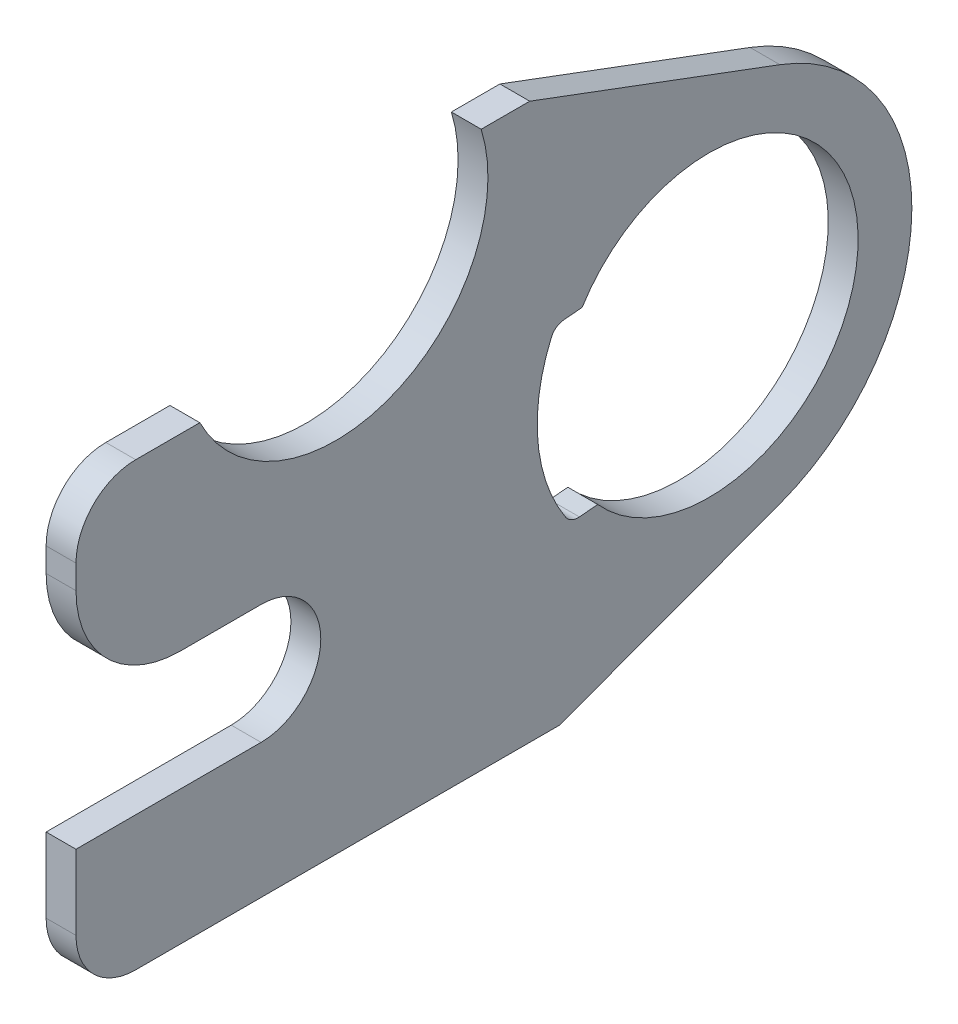
ISO-10303-21;
HEADER;
FILE_DESCRIPTION(('STEP AP214'),'2;1');
FILE_NAME('part.step','',(''),(''),'','','');
FILE_SCHEMA(('AUTOMOTIVE_DESIGN { 1 0 10303 214 1 1 1 1 }'));
ENDSEC;
DATA;
#1=APPLICATION_CONTEXT('core data for automotive mechanical design processes');
#2=APPLICATION_PROTOCOL_DEFINITION('international standard','automotive_design',2000,#1);
#3=PRODUCT_CONTEXT('',#1,'mechanical');
#4=PRODUCT('Part','Part','',(#3));
#5=PRODUCT_RELATED_PRODUCT_CATEGORY('part','',(#4));
#6=PRODUCT_DEFINITION_FORMATION('','',#4);
#7=PRODUCT_DEFINITION_CONTEXT('part definition',#1,'design');
#8=PRODUCT_DEFINITION('design','',#6,#7);
#9=PRODUCT_DEFINITION_SHAPE('','',#8);
#10=(LENGTH_UNIT() NAMED_UNIT(*) SI_UNIT(.MILLI.,.METRE.));
#11=(NAMED_UNIT(*) PLANE_ANGLE_UNIT() SI_UNIT($,.RADIAN.));
#12=(NAMED_UNIT(*) SI_UNIT($,.STERADIAN.) SOLID_ANGLE_UNIT());
#13=UNCERTAINTY_MEASURE_WITH_UNIT(LENGTH_MEASURE(1.E-05),#10,'distance_accuracy_value','');
#14=(GEOMETRIC_REPRESENTATION_CONTEXT(3) GLOBAL_UNCERTAINTY_ASSIGNED_CONTEXT((#13)) GLOBAL_UNIT_ASSIGNED_CONTEXT((#10,
#11,#12)) REPRESENTATION_CONTEXT('',''));
#15=CARTESIAN_POINT('',(0.,0.,0.));
#16=DIRECTION('',(0.,0.,1.));
#17=DIRECTION('',(1.,0.,0.));
#18=AXIS2_PLACEMENT_3D('',#15,#16,#17);
#19=CARTESIAN_POINT('',(9.9999999999969,-25.9999999999938,149.999999999999));
#20=DIRECTION('',(1.,0.,0.));
#21=DIRECTION('',(0.,0.,-1.));
#22=AXIS2_PLACEMENT_3D('',#19,#20,#21);
#23=PLANE('',#22);
#24=DIRECTION('',(0.,-0.0871557427476621,0.996194698091745));
#25=VECTOR('',#24,1.);
#26=CARTESIAN_POINT('',(10.0000000000009,26.3996112328521,42.4624602061012));
#27=LINE('',#26,#25);
#28=CARTESIAN_POINT('',(10.0000000000009,26.3996112328521,42.4624602061012));
#29=VERTEX_POINT('',#28);
#30=CARTESIAN_POINT('',(10.,25.8622557011653,48.6044620384565));
#31=VERTEX_POINT('',#30);
#32=EDGE_CURVE('E176',#29,#31,#27,.T.);
#33=ORIENTED_EDGE('',*,*,#32,.F.);
#34=CARTESIAN_POINT('',(10.,6.21724893790088E-12,8.88178419700125E-13));
#35=DIRECTION('',(1.,0.,0.));
#36=DIRECTION('',(0.,0.,-1.));
#37=AXIS2_PLACEMENT_3D('',#34,#35,#36);
#38=CIRCLE('',#37,50.);
#39=CARTESIAN_POINT('',(10.,-33.3720706526527,37.2331156412411));
#40=VERTEX_POINT('',#39);
#41=EDGE_CURVE('E188',#40,#29,#38,.T.);
#42=ORIENTED_EDGE('',*,*,#41,.F.);
#43=DIRECTION('',(0.,0.0871557427476621,-0.996194698091745));
#44=VECTOR('',#43,1.);
#45=CARTESIAN_POINT('',(10.,-33.3720706526527,37.2331156412411));
#46=LINE('',#45,#44);
#47=CARTESIAN_POINT('',(10.0000000000009,-33.9094261843395,43.3751174735981));
#48=VERTEX_POINT('',#47);
#49=EDGE_CURVE('E190',#48,#40,#46,.T.);
#50=ORIENTED_EDGE('',*,*,#49,.F.);
#51=CARTESIAN_POINT('',(9.9999999999979,-28.9284526938807,43.8108961873347));
#52=DIRECTION('',(1.,0.,0.));
#53=DIRECTION('',(0.,0.,-1.));
#54=AXIS2_PLACEMENT_3D('',#51,#52,#53);
#55=CIRCLE('',#54,5.);
#56=CARTESIAN_POINT('',(10.,-31.6835434266318,47.983362490891));
#57=VERTEX_POINT('',#56);
#58=EDGE_CURVE('E321',#48,#57,#55,.F.);
#59=ORIENTED_EDGE('',*,*,#58,.T.);
#60=CARTESIAN_POINT('',(10.,6.21724893790088E-12,8.88178419700125E-13));
#61=DIRECTION('',(1.,0.,0.));
#62=DIRECTION('',(0.,0.,-1.));
#63=AXIS2_PLACEMENT_3D('',#60,#61,#62);
#64=CIRCLE('',#63,57.5);
#65=CARTESIAN_POINT('',(10.0000000000031,22.8699757545827,52.7561769746914));
#66=VERTEX_POINT('',#65);
#67=EDGE_CURVE('E336',#66,#57,#64,.T.);
#68=ORIENTED_EDGE('',*,*,#67,.F.);
#69=CARTESIAN_POINT('',(10.0000000000031,20.8812822107065,48.1686833247181));
#70=DIRECTION('',(1.,0.,0.));
#71=DIRECTION('',(0.,0.,-1.));
#72=AXIS2_PLACEMENT_3D('',#69,#70,#71);
#73=CIRCLE('',#72,5.);
#74=EDGE_CURVE('E42',#66,#31,#73,.F.);
#75=ORIENTED_EDGE('',*,*,#74,.T.);
#76=EDGE_LOOP('',(#33,#42,#50,#59,#68,#75));
#77=FACE_BOUND('',#76,.T.);
#78=DIRECTION('',(0.,-1.,0.));
#79=VECTOR('',#78,1.);
#80=CARTESIAN_POINT('',(10.,-5.99999999999379,211.999999999999));
#81=LINE('',#80,#79);
#82=CARTESIAN_POINT('',(9.9999999999969,37.0000000000061,211.999999999999));
#83=VERTEX_POINT('',#82);
#84=CARTESIAN_POINT('',(10.,29.0000000000061,211.999999999999));
#85=VERTEX_POINT('',#84);
#86=EDGE_CURVE('E224',#83,#85,#81,.T.);
#87=ORIENTED_EDGE('',*,*,#86,.T.);
#88=CARTESIAN_POINT('',(10.,29.0000000000061,176.999999999999));
#89=DIRECTION('',(1.,0.,0.));
#90=DIRECTION('',(0.,0.,-1.));
#91=AXIS2_PLACEMENT_3D('',#88,#89,#90);
#92=CIRCLE('',#91,35.);
#93=CARTESIAN_POINT('',(10.,-5.99999999999379,176.999999999999));
#94=VERTEX_POINT('',#93);
#95=EDGE_CURVE('E307',#85,#94,#92,.T.);
#96=ORIENTED_EDGE('',*,*,#95,.T.);
#97=DIRECTION('',(0.,0.,-1.));
#98=VECTOR('',#97,1.);
#99=CARTESIAN_POINT('',(10.,-5.99999999999379,149.999999999999));
#100=LINE('',#99,#98);
#101=CARTESIAN_POINT('',(10.,-5.99999999999379,149.999999999999));
#102=VERTEX_POINT('',#101);
#103=EDGE_CURVE('E227',#94,#102,#100,.T.);
#104=ORIENTED_EDGE('',*,*,#103,.T.);
#105=CARTESIAN_POINT('',(9.9999999999969,-25.9999999999938,149.999999999999));
#106=DIRECTION('',(-1.,0.,0.));
#107=DIRECTION('',(0.,0.,-1.));
#108=AXIS2_PLACEMENT_3D('',#105,#106,#107);
#109=CIRCLE('',#108,20.);
#110=CARTESIAN_POINT('',(10.0000000000031,-45.9999999999938,149.999999999999));
#111=VERTEX_POINT('',#110);
#112=EDGE_CURVE('E229',#102,#111,#109,.T.);
#113=ORIENTED_EDGE('',*,*,#112,.T.);
#114=DIRECTION('',(0.,0.,1.));
#115=VECTOR('',#114,1.);
#116=CARTESIAN_POINT('',(10.0000000000031,-45.9999999999938,211.999999999999));
#117=LINE('',#116,#115);
#118=CARTESIAN_POINT('',(10.0000000000031,-45.9999999999938,211.999999999999));
#119=VERTEX_POINT('',#118);
#120=EDGE_CURVE('E231',#111,#119,#117,.T.);
#121=ORIENTED_EDGE('',*,*,#120,.T.);
#122=DIRECTION('',(0.,-1.,0.));
#123=VECTOR('',#122,1.);
#124=CARTESIAN_POINT('',(9.9999999999969,-90.9999999999939,211.999999999999));
#125=LINE('',#124,#123);
#126=CARTESIAN_POINT('',(10.0000000000062,-70.9999999999938,211.999999999999));
#127=VERTEX_POINT('',#126);
#128=EDGE_CURVE('E205',#119,#127,#125,.T.);
#129=ORIENTED_EDGE('',*,*,#128,.T.);
#130=CARTESIAN_POINT('',(10.0000000000062,-70.9999999999938,191.999999999999));
#131=DIRECTION('',(1.,0.,0.));
#132=DIRECTION('',(0.,0.,-1.));
#133=AXIS2_PLACEMENT_3D('',#130,#131,#132);
#134=CIRCLE('',#133,20.);
#135=CARTESIAN_POINT('',(9.9999999999969,-90.9999999999939,191.999999999998));
#136=VERTEX_POINT('',#135);
#137=EDGE_CURVE('E293',#127,#136,#134,.T.);
#138=ORIENTED_EDGE('',*,*,#137,.T.);
#139=DIRECTION('',(0.,0.,-1.));
#140=VECTOR('',#139,1.);
#141=CARTESIAN_POINT('',(9.9999999999969,-90.9999999999939,211.999999999999));
#142=LINE('',#141,#140);
#143=CARTESIAN_POINT('',(9.9999999999969,-90.9999999999939,49.9999999999989));
#144=VERTEX_POINT('',#143);
#145=EDGE_CURVE('E208',#136,#144,#142,.T.);
#146=ORIENTED_EDGE('',*,*,#145,.T.);
#147=DIRECTION('',(0.,0.346948924771803,-0.937884024599892));
#148=VECTOR('',#147,1.);
#149=CARTESIAN_POINT('',(9.9999999999969,-90.9999999999939,49.9999999999989));
#150=LINE('',#149,#148);
#151=CARTESIAN_POINT('',(10.0000000000006,-63.7761136727865,-23.5925268844817));
#152=VERTEX_POINT('',#151);
#153=EDGE_CURVE('E211',#144,#152,#150,.T.);
#154=ORIENTED_EDGE('',*,*,#153,.T.);
#155=CARTESIAN_POINT('',(10.,6.21724893790088E-12,8.88178419700125E-13));
#156=DIRECTION('',(1.,0.,0.));
#157=DIRECTION('',(0.,0.,-1.));
#158=AXIS2_PLACEMENT_3D('',#155,#156,#157);
#159=CIRCLE('',#158,68.);
#160=CARTESIAN_POINT('',(10.0000000000001,63.7013149393039,-23.7937486538868));
#161=VERTEX_POINT('',#160);
#162=EDGE_CURVE('E213',#152,#161,#159,.T.);
#163=ORIENTED_EDGE('',*,*,#162,.T.);
#164=DIRECTION('',(0.,0.349908068439531,0.936784043224967));
#165=VECTOR('',#164,1.);
#166=CARTESIAN_POINT('',(10.0000000000009,95.0000000000062,59.9999999999987));
#167=LINE('',#166,#165);
#168=CARTESIAN_POINT('',(10.0000000000009,95.0000000000062,59.9999999999987));
#169=VERTEX_POINT('',#168);
#170=EDGE_CURVE('E215',#161,#169,#167,.T.);
#171=ORIENTED_EDGE('',*,*,#170,.T.);
#172=DIRECTION('',(0.,0.,1.));
#173=VECTOR('',#172,1.);
#174=CARTESIAN_POINT('',(10.0000000000009,95.0000000000062,59.9999999999987));
#175=LINE('',#174,#173);
#176=CARTESIAN_POINT('',(10.0000000000009,95.0000000000061,76.2557695721835));
#177=VERTEX_POINT('',#176);
#178=EDGE_CURVE('E217',#169,#177,#175,.T.);
#179=ORIENTED_EDGE('',*,*,#178,.T.);
#180=CARTESIAN_POINT('',(10.0000000000071,80.0000000000062,124.999999999998));
#181=DIRECTION('',(-1.,0.,0.));
#182=DIRECTION('',(0.,0.,-1.));
#183=AXIS2_PLACEMENT_3D('',#180,#181,#182);
#184=CIRCLE('',#183,51.);
#185=CARTESIAN_POINT('',(10.0000000000009,57.0000000000062,170.519226706963));
#186=VERTEX_POINT('',#185);
#187=EDGE_CURVE('E219',#177,#186,#184,.T.);
#188=ORIENTED_EDGE('',*,*,#187,.T.);
#189=DIRECTION('',(0.,0.,1.));
#190=VECTOR('',#189,1.);
#191=CARTESIAN_POINT('',(10.,57.0000000000062,211.999999999999));
#192=LINE('',#191,#190);
#193=CARTESIAN_POINT('',(10.,57.0000000000062,191.999999999999));
#194=VERTEX_POINT('',#193);
#195=EDGE_CURVE('E221',#186,#194,#192,.T.);
#196=ORIENTED_EDGE('',*,*,#195,.T.);
#197=CARTESIAN_POINT('',(9.9999999999969,37.0000000000061,191.999999999998));
#198=DIRECTION('',(1.,0.,0.));
#199=DIRECTION('',(0.,0.,-1.));
#200=AXIS2_PLACEMENT_3D('',#197,#198,#199);
#201=CIRCLE('',#200,20.);
#202=EDGE_CURVE('E291',#194,#83,#201,.T.);
#203=ORIENTED_EDGE('',*,*,#202,.T.);
#204=EDGE_LOOP('',(#87,#96,#104,#113,#121,#129,#138,#146,#154,#163,#171,#179,#188,#196,#203));
#205=FACE_BOUND('',#204,.T.);
#206=ADVANCED_FACE('F34',(#77,#205),#23,.T.);
#207=CARTESIAN_POINT('',(-3.10862446895044E-12,-26.,150.));
#208=DIRECTION('',(1.,0.,0.));
#209=DIRECTION('',(0.,0.,-1.));
#210=AXIS2_PLACEMENT_3D('',#207,#208,#209);
#211=PLANE('',#210);
#212=DIRECTION('',(0.,0.,-1.));
#213=VECTOR('',#212,1.);
#214=CARTESIAN_POINT('',(0.,-6.00000000000001,150.));
#215=LINE('',#214,#213);
#216=CARTESIAN_POINT('',(0.,-6.00000000000001,177.));
#217=VERTEX_POINT('',#216);
#218=CARTESIAN_POINT('',(0.,-6.00000000000001,150.));
#219=VERTEX_POINT('',#218);
#220=EDGE_CURVE('E251',#217,#219,#215,.T.);
#221=ORIENTED_EDGE('',*,*,#220,.F.);
#222=CARTESIAN_POINT('',(0.,29.,177.));
#223=DIRECTION('',(1.,0.,0.));
#224=DIRECTION('',(0.,0.,-1.));
#225=AXIS2_PLACEMENT_3D('',#222,#223,#224);
#226=CIRCLE('',#225,35.);
#227=CARTESIAN_POINT('',(0.,29.,212.000000000001));
#228=VERTEX_POINT('',#227);
#229=EDGE_CURVE('E303',#217,#228,#226,.F.);
#230=ORIENTED_EDGE('',*,*,#229,.T.);
#231=DIRECTION('',(0.,-1.,0.));
#232=VECTOR('',#231,1.);
#233=CARTESIAN_POINT('',(0.,-6.00000000000001,212.000000000001));
#234=LINE('',#233,#232);
#235=CARTESIAN_POINT('',(-3.10862446895044E-12,37.,212.000000000001));
#236=VERTEX_POINT('',#235);
#237=EDGE_CURVE('E248',#236,#228,#234,.T.);
#238=ORIENTED_EDGE('',*,*,#237,.F.);
#239=CARTESIAN_POINT('',(-3.10862446895044E-12,37.,192.));
#240=DIRECTION('',(1.,0.,0.));
#241=DIRECTION('',(0.,0.,-1.));
#242=AXIS2_PLACEMENT_3D('',#239,#240,#241);
#243=CIRCLE('',#242,20.);
#244=CARTESIAN_POINT('',(0.,57.,192.));
#245=VERTEX_POINT('',#244);
#246=EDGE_CURVE('E285',#236,#245,#243,.F.);
#247=ORIENTED_EDGE('',*,*,#246,.T.);
#248=DIRECTION('',(0.,0.,1.));
#249=VECTOR('',#248,1.);
#250=CARTESIAN_POINT('',(0.,57.,212.000000000001));
#251=LINE('',#250,#249);
#252=CARTESIAN_POINT('',(8.88178419700125E-13,57.,170.519226706965));
#253=VERTEX_POINT('',#252);
#254=EDGE_CURVE('E245',#253,#245,#251,.T.);
#255=ORIENTED_EDGE('',*,*,#254,.F.);
#256=CARTESIAN_POINT('',(7.105427357601E-12,80.,125.000000000001));
#257=DIRECTION('',(-1.,0.,0.));
#258=DIRECTION('',(0.,0.,-1.));
#259=AXIS2_PLACEMENT_3D('',#256,#257,#258);
#260=CIRCLE('',#259,51.);
#261=CARTESIAN_POINT('',(8.88178419700125E-13,95.,76.2557695721844));
#262=VERTEX_POINT('',#261);
#263=EDGE_CURVE('E243',#262,#253,#260,.T.);
#264=ORIENTED_EDGE('',*,*,#263,.F.);
#265=DIRECTION('',(0.,0.,1.));
#266=VECTOR('',#265,1.);
#267=CARTESIAN_POINT('',(8.88178419700125E-13,95.,59.9999999999996));
#268=LINE('',#267,#266);
#269=CARTESIAN_POINT('',(8.88178419700125E-13,95.,59.9999999999996));
#270=VERTEX_POINT('',#269);
#271=EDGE_CURVE('E241',#270,#262,#268,.T.);
#272=ORIENTED_EDGE('',*,*,#271,.F.);
#273=DIRECTION('',(0.,0.349908068439531,0.936784043224967));
#274=VECTOR('',#273,1.);
#275=CARTESIAN_POINT('',(8.88178419700125E-13,95.,59.9999999999996));
#276=LINE('',#275,#274);
#277=CARTESIAN_POINT('',(5.55111512312578E-13,63.7013149392978,-23.7937486538886));
#278=VERTEX_POINT('',#277);
#279=EDGE_CURVE('E239',#278,#270,#276,.T.);
#280=ORIENTED_EDGE('',*,*,#279,.F.);
#281=CARTESIAN_POINT('',(0.,0.,0.));
#282=DIRECTION('',(1.,0.,0.));
#283=DIRECTION('',(0.,0.,-1.));
#284=AXIS2_PLACEMENT_3D('',#281,#282,#283);
#285=CIRCLE('',#284,68.);
#286=CARTESIAN_POINT('',(8.88178419700125E-13,-63.7761136727927,-23.5925268844825));
#287=VERTEX_POINT('',#286);
#288=EDGE_CURVE('E237',#287,#278,#285,.T.);
#289=ORIENTED_EDGE('',*,*,#288,.F.);
#290=DIRECTION('',(0.,0.346948924771803,-0.937884024599892));
#291=VECTOR('',#290,1.);
#292=CARTESIAN_POINT('',(-3.10862446895044E-12,-91.,49.9999999999998));
#293=LINE('',#292,#291);
#294=CARTESIAN_POINT('',(-3.10862446895044E-12,-91.,49.9999999999998));
#295=VERTEX_POINT('',#294);
#296=EDGE_CURVE('E235',#295,#287,#293,.T.);
#297=ORIENTED_EDGE('',*,*,#296,.F.);
#298=DIRECTION('',(0.,0.,-1.));
#299=VECTOR('',#298,1.);
#300=CARTESIAN_POINT('',(-3.10862446895044E-12,-91.,212.000000000001));
#301=LINE('',#300,#299);
#302=CARTESIAN_POINT('',(-3.10862446895044E-12,-91.,192.));
#303=VERTEX_POINT('',#302);
#304=EDGE_CURVE('E199',#303,#295,#301,.T.);
#305=ORIENTED_EDGE('',*,*,#304,.F.);
#306=CARTESIAN_POINT('',(6.21724893790088E-12,-71.0000000000001,192.));
#307=DIRECTION('',(1.,0.,0.));
#308=DIRECTION('',(0.,0.,-1.));
#309=AXIS2_PLACEMENT_3D('',#306,#307,#308);
#310=CIRCLE('',#309,20.);
#311=CARTESIAN_POINT('',(6.21724893790088E-12,-71.0000000000001,212.000000000001));
#312=VERTEX_POINT('',#311);
#313=EDGE_CURVE('E287',#303,#312,#310,.F.);
#314=ORIENTED_EDGE('',*,*,#313,.T.);
#315=DIRECTION('',(0.,-1.,0.));
#316=VECTOR('',#315,1.);
#317=CARTESIAN_POINT('',(-3.10862446895044E-12,-91.,212.000000000001));
#318=LINE('',#317,#316);
#319=CARTESIAN_POINT('',(3.10862446895044E-12,-46.,212.000000000001));
#320=VERTEX_POINT('',#319);
#321=EDGE_CURVE('E195',#320,#312,#318,.T.);
#322=ORIENTED_EDGE('',*,*,#321,.F.);
#323=DIRECTION('',(0.,0.,1.));
#324=VECTOR('',#323,1.);
#325=CARTESIAN_POINT('',(3.10862446895044E-12,-46.,212.000000000001));
#326=LINE('',#325,#324);
#327=CARTESIAN_POINT('',(3.10862446895044E-12,-46.,150.));
#328=VERTEX_POINT('',#327);
#329=EDGE_CURVE('E209',#328,#320,#326,.T.);
#330=ORIENTED_EDGE('',*,*,#329,.F.);
#331=CARTESIAN_POINT('',(-3.10862446895044E-12,-26.,150.));
#332=DIRECTION('',(-1.,0.,0.));
#333=DIRECTION('',(0.,0.,-1.));
#334=AXIS2_PLACEMENT_3D('',#331,#332,#333);
#335=CIRCLE('',#334,20.);
#336=EDGE_CURVE('E253',#219,#328,#335,.T.);
#337=ORIENTED_EDGE('',*,*,#336,.F.);
#338=EDGE_LOOP('',(#221,#230,#238,#247,#255,#264,#272,#280,#289,#297,#305,#314,#322,#330,#337));
#339=FACE_BOUND('',#338,.T.);
#340=CARTESIAN_POINT('',(0.,0.,0.));
#341=DIRECTION('',(1.,0.,0.));
#342=DIRECTION('',(0.,0.,-1.));
#343=AXIS2_PLACEMENT_3D('',#340,#341,#342);
#344=CIRCLE('',#343,50.);
#345=CARTESIAN_POINT('',(0.,-33.3720706526588,37.2331156412402));
#346=VERTEX_POINT('',#345);
#347=CARTESIAN_POINT('',(8.88178419700125E-13,26.3996112328458,42.4624602061003));
#348=VERTEX_POINT('',#347);
#349=EDGE_CURVE('E196',#346,#348,#344,.T.);
#350=ORIENTED_EDGE('',*,*,#349,.T.);
#351=DIRECTION('',(0.,-0.0871557427476622,0.996194698091745));
#352=VECTOR('',#351,1.);
#353=CARTESIAN_POINT('',(7.105427357601E-12,16.6647284068907,153.732680068016));
#354=LINE('',#353,#352);
#355=CARTESIAN_POINT('',(0.,25.8622557011591,48.6044620384574));
#356=VERTEX_POINT('',#355);
#357=EDGE_CURVE('E177',#348,#356,#354,.T.);
#358=ORIENTED_EDGE('',*,*,#357,.T.);
#359=CARTESIAN_POINT('',(3.10862446895044E-12,20.8812822107004,48.168683324719));
#360=DIRECTION('',(1.,0.,0.));
#361=DIRECTION('',(0.,0.,-1.));
#362=AXIS2_PLACEMENT_3D('',#359,#360,#361);
#363=CIRCLE('',#362,5.);
#364=CARTESIAN_POINT('',(3.10862446895044E-12,22.8699757545766,52.7561769746923));
#365=VERTEX_POINT('',#364);
#366=EDGE_CURVE('E11',#356,#365,#363,.T.);
#367=ORIENTED_EDGE('',*,*,#366,.T.);
#368=CARTESIAN_POINT('',(0.,0.,0.));
#369=DIRECTION('',(1.,0.,0.));
#370=DIRECTION('',(0.,0.,-1.));
#371=AXIS2_PLACEMENT_3D('',#368,#369,#370);
#372=CIRCLE('',#371,57.5);
#373=CARTESIAN_POINT('',(0.,-31.683543426638,47.9833624908919));
#374=VERTEX_POINT('',#373);
#375=EDGE_CURVE('E182',#365,#374,#372,.T.);
#376=ORIENTED_EDGE('',*,*,#375,.T.);
#377=CARTESIAN_POINT('',(-1.77635683940025E-12,-28.9284526938869,43.8108961873365));
#378=DIRECTION('',(1.,0.,0.));
#379=DIRECTION('',(0.,0.,-1.));
#380=AXIS2_PLACEMENT_3D('',#377,#378,#379);
#381=CIRCLE('',#380,5.);
#382=CARTESIAN_POINT('',(8.88178419700125E-13,-33.9094261843457,43.3751174735972));
#383=VERTEX_POINT('',#382);
#384=EDGE_CURVE('E323',#374,#383,#381,.T.);
#385=ORIENTED_EDGE('',*,*,#384,.T.);
#386=DIRECTION('',(0.,0.0871557427476622,-0.996194698091745));
#387=VECTOR('',#386,1.);
#388=CARTESIAN_POINT('',(3.10862446895044E-12,-43.106953478614,148.503335503156));
#389=LINE('',#388,#387);
#390=EDGE_CURVE('E189',#383,#346,#389,.T.);
#391=ORIENTED_EDGE('',*,*,#390,.T.);
#392=EDGE_LOOP('',(#350,#358,#367,#376,#385,#391));
#393=FACE_BOUND('',#392,.T.);
#394=ADVANCED_FACE('F327',(#339,#393),#211,.F.);
#395=CARTESIAN_POINT('',(9.9999999999969,-90.9999999999939,211.999999999999));
#396=DIRECTION('',(0.,0.,-1.));
#397=DIRECTION('',(-1.,0.,0.));
#398=AXIS2_PLACEMENT_3D('',#395,#396,#397);
#399=PLANE('',#398);
#400=ORIENTED_EDGE('',*,*,#321,.T.);
#401=DIRECTION('',(-1.,0.,0.));
#402=VECTOR('',#401,1.);
#403=CARTESIAN_POINT('',(10.0000000000062,-70.9999999999938,211.999999999999));
#404=LINE('',#403,#402);
#405=EDGE_CURVE('E289',#312,#127,#404,.F.);
#406=ORIENTED_EDGE('',*,*,#405,.T.);
#407=ORIENTED_EDGE('',*,*,#128,.F.);
#408=DIRECTION('',(-1.,0.,0.));
#409=VECTOR('',#408,1.);
#410=CARTESIAN_POINT('',(10.0000000000031,-45.9999999999938,211.999999999999));
#411=LINE('',#410,#409);
#412=EDGE_CURVE('E232',#119,#320,#411,.T.);
#413=ORIENTED_EDGE('',*,*,#412,.T.);
#414=EDGE_LOOP('',(#400,#406,#407,#413));
#415=FACE_BOUND('',#414,.T.);
#416=ADVANCED_FACE('F353',(#415),#399,.F.);
#417=CARTESIAN_POINT('',(9.9999999999969,-90.9999999999939,211.999999999999));
#418=DIRECTION('',(0.,1.,0.));
#419=DIRECTION('',(0.,0.,1.));
#420=AXIS2_PLACEMENT_3D('',#417,#418,#419);
#421=PLANE('',#420);
#422=ORIENTED_EDGE('',*,*,#145,.F.);
#423=DIRECTION('',(-1.,0.,0.));
#424=VECTOR('',#423,1.);
#425=CARTESIAN_POINT('',(9.9999999999969,-90.9999999999939,191.999999999998));
#426=LINE('',#425,#424);
#427=EDGE_CURVE('E282',#136,#303,#426,.T.);
#428=ORIENTED_EDGE('',*,*,#427,.T.);
#429=ORIENTED_EDGE('',*,*,#304,.T.);
#430=DIRECTION('',(-1.,0.,0.));
#431=VECTOR('',#430,1.);
#432=CARTESIAN_POINT('',(9.9999999999969,-90.9999999999939,49.9999999999989));
#433=LINE('',#432,#431);
#434=EDGE_CURVE('E279',#144,#295,#433,.T.);
#435=ORIENTED_EDGE('',*,*,#434,.F.);
#436=EDGE_LOOP('',(#422,#428,#429,#435));
#437=FACE_BOUND('',#436,.T.);
#438=ADVANCED_FACE('F398',(#437),#421,.F.);
#439=CARTESIAN_POINT('',(9.9999999999969,-90.9999999999939,49.9999999999989));
#440=DIRECTION('',(0.,0.937884024599892,0.346948924771803));
#441=DIRECTION('',(0.,-0.346948924771803,0.937884024599892));
#442=AXIS2_PLACEMENT_3D('',#439,#440,#441);
#443=PLANE('',#442);
#444=ORIENTED_EDGE('',*,*,#296,.T.);
#445=DIRECTION('',(-1.,0.,0.));
#446=VECTOR('',#445,1.);
#447=CARTESIAN_POINT('',(10.0000000000006,-63.7761136727865,-23.5925268844817));
#448=LINE('',#447,#446);
#449=EDGE_CURVE('E276',#152,#287,#448,.T.);
#450=ORIENTED_EDGE('',*,*,#449,.F.);
#451=ORIENTED_EDGE('',*,*,#153,.F.);
#452=ORIENTED_EDGE('',*,*,#434,.T.);
#453=EDGE_LOOP('',(#444,#450,#451,#452));
#454=FACE_BOUND('',#453,.T.);
#455=ADVANCED_FACE('F394',(#454),#443,.F.);
#456=CARTESIAN_POINT('',(10.,6.21724893790088E-12,8.88178419700125E-13));
#457=DIRECTION('',(-1.,0.,0.));
#458=DIRECTION('',(0.,0.,1.));
#459=AXIS2_PLACEMENT_3D('',#456,#457,#458);
#460=CYLINDRICAL_SURFACE('',#459,68.);
#461=ORIENTED_EDGE('',*,*,#288,.T.);
#462=DIRECTION('',(-1.,0.,0.));
#463=VECTOR('',#462,1.);
#464=CARTESIAN_POINT('',(10.0000000000001,63.7013149393039,-23.7937486538868));
#465=LINE('',#464,#463);
#466=EDGE_CURVE('E273',#161,#278,#465,.T.);
#467=ORIENTED_EDGE('',*,*,#466,.F.);
#468=ORIENTED_EDGE('',*,*,#162,.F.);
#469=ORIENTED_EDGE('',*,*,#449,.T.);
#470=EDGE_LOOP('',(#461,#467,#468,#469));
#471=FACE_BOUND('',#470,.T.);
#472=ADVANCED_FACE('F390',(#471),#460,.T.);
#473=CARTESIAN_POINT('',(10.0000000000009,95.0000000000062,59.9999999999987));
#474=DIRECTION('',(0.,-0.936784043224967,0.349908068439531));
#475=DIRECTION('',(0.,-0.349908068439531,-0.936784043224967));
#476=AXIS2_PLACEMENT_3D('',#473,#474,#475);
#477=PLANE('',#476);
#478=ORIENTED_EDGE('',*,*,#279,.T.);
#479=DIRECTION('',(-1.,0.,0.));
#480=VECTOR('',#479,1.);
#481=CARTESIAN_POINT('',(10.0000000000009,95.0000000000062,59.9999999999987));
#482=LINE('',#481,#480);
#483=EDGE_CURVE('E270',#169,#270,#482,.T.);
#484=ORIENTED_EDGE('',*,*,#483,.F.);
#485=ORIENTED_EDGE('',*,*,#170,.F.);
#486=ORIENTED_EDGE('',*,*,#466,.T.);
#487=EDGE_LOOP('',(#478,#484,#485,#486));
#488=FACE_BOUND('',#487,.T.);
#489=ADVANCED_FACE('F386',(#488),#477,.F.);
#490=CARTESIAN_POINT('',(10.0000000000009,95.0000000000062,59.9999999999987));
#491=DIRECTION('',(0.,-1.,0.));
#492=DIRECTION('',(0.,0.,-1.));
#493=AXIS2_PLACEMENT_3D('',#490,#491,#492);
#494=PLANE('',#493);
#495=ORIENTED_EDGE('',*,*,#271,.T.);
#496=DIRECTION('',(-1.,0.,0.));
#497=VECTOR('',#496,1.);
#498=CARTESIAN_POINT('',(10.0000000000009,95.0000000000061,76.2557695721835));
#499=LINE('',#498,#497);
#500=EDGE_CURVE('E267',#177,#262,#499,.T.);
#501=ORIENTED_EDGE('',*,*,#500,.F.);
#502=ORIENTED_EDGE('',*,*,#178,.F.);
#503=ORIENTED_EDGE('',*,*,#483,.T.);
#504=EDGE_LOOP('',(#495,#501,#502,#503));
#505=FACE_BOUND('',#504,.T.);
#506=ADVANCED_FACE('F382',(#505),#494,.F.);
#507=CARTESIAN_POINT('',(10.0000000000071,80.0000000000062,124.999999999998));
#508=DIRECTION('',(-1.,0.,0.));
#509=DIRECTION('',(0.,0.,1.));
#510=AXIS2_PLACEMENT_3D('',#507,#508,#509);
#511=CYLINDRICAL_SURFACE('',#510,51.);
#512=ORIENTED_EDGE('',*,*,#263,.T.);
#513=DIRECTION('',(-1.,0.,0.));
#514=VECTOR('',#513,1.);
#515=CARTESIAN_POINT('',(10.0000000000009,57.0000000000062,170.519226706963));
#516=LINE('',#515,#514);
#517=EDGE_CURVE('E264',#186,#253,#516,.T.);
#518=ORIENTED_EDGE('',*,*,#517,.F.);
#519=ORIENTED_EDGE('',*,*,#187,.F.);
#520=ORIENTED_EDGE('',*,*,#500,.T.);
#521=EDGE_LOOP('',(#512,#518,#519,#520));
#522=FACE_BOUND('',#521,.T.);
#523=ADVANCED_FACE('F378',(#522),#511,.F.);
#524=CARTESIAN_POINT('',(10.,57.0000000000062,211.999999999999));
#525=DIRECTION('',(0.,-1.,0.));
#526=DIRECTION('',(0.,0.,-1.));
#527=AXIS2_PLACEMENT_3D('',#524,#525,#526);
#528=PLANE('',#527);
#529=ORIENTED_EDGE('',*,*,#254,.T.);
#530=DIRECTION('',(-1.,0.,0.));
#531=VECTOR('',#530,1.);
#532=CARTESIAN_POINT('',(10.,57.0000000000062,191.999999999999));
#533=LINE('',#532,#531);
#534=EDGE_CURVE('E298',#245,#194,#533,.F.);
#535=ORIENTED_EDGE('',*,*,#534,.T.);
#536=ORIENTED_EDGE('',*,*,#195,.F.);
#537=ORIENTED_EDGE('',*,*,#517,.T.);
#538=EDGE_LOOP('',(#529,#535,#536,#537));
#539=FACE_BOUND('',#538,.T.);
#540=ADVANCED_FACE('F374',(#539),#528,.F.);
#541=CARTESIAN_POINT('',(10.,-5.99999999999379,211.999999999999));
#542=DIRECTION('',(0.,0.,-1.));
#543=DIRECTION('',(-1.,0.,0.));
#544=AXIS2_PLACEMENT_3D('',#541,#542,#543);
#545=PLANE('',#544);
#546=ORIENTED_EDGE('',*,*,#237,.T.);
#547=DIRECTION('',(-1.,0.,0.));
#548=VECTOR('',#547,1.);
#549=CARTESIAN_POINT('',(10.,29.0000000000061,211.999999999999));
#550=LINE('',#549,#548);
#551=EDGE_CURVE('E305',#228,#85,#550,.F.);
#552=ORIENTED_EDGE('',*,*,#551,.T.);
#553=ORIENTED_EDGE('',*,*,#86,.F.);
#554=DIRECTION('',(-1.,0.,0.));
#555=VECTOR('',#554,1.);
#556=CARTESIAN_POINT('',(9.9999999999969,37.0000000000061,211.999999999999));
#557=LINE('',#556,#555);
#558=EDGE_CURVE('E295',#83,#236,#557,.T.);
#559=ORIENTED_EDGE('',*,*,#558,.T.);
#560=EDGE_LOOP('',(#546,#552,#553,#559));
#561=FACE_BOUND('',#560,.T.);
#562=ADVANCED_FACE('F370',(#561),#545,.F.);
#563=CARTESIAN_POINT('',(10.,-5.99999999999379,149.999999999999));
#564=DIRECTION('',(0.,1.,0.));
#565=DIRECTION('',(0.,0.,1.));
#566=AXIS2_PLACEMENT_3D('',#563,#564,#565);
#567=PLANE('',#566);
#568=ORIENTED_EDGE('',*,*,#103,.F.);
#569=DIRECTION('',(-1.,0.,0.));
#570=VECTOR('',#569,1.);
#571=CARTESIAN_POINT('',(10.,-5.99999999999379,176.999999999999));
#572=LINE('',#571,#570);
#573=EDGE_CURVE('E300',#94,#217,#572,.T.);
#574=ORIENTED_EDGE('',*,*,#573,.T.);
#575=ORIENTED_EDGE('',*,*,#220,.T.);
#576=DIRECTION('',(-1.,0.,0.));
#577=VECTOR('',#576,1.);
#578=CARTESIAN_POINT('',(10.,-5.99999999999379,149.999999999999));
#579=LINE('',#578,#577);
#580=EDGE_CURVE('E261',#102,#219,#579,.T.);
#581=ORIENTED_EDGE('',*,*,#580,.F.);
#582=EDGE_LOOP('',(#568,#574,#575,#581));
#583=FACE_BOUND('',#582,.T.);
#584=ADVANCED_FACE('F366',(#583),#567,.F.);
#585=CARTESIAN_POINT('',(9.9999999999969,-25.9999999999938,149.999999999999));
#586=DIRECTION('',(-1.,0.,0.));
#587=DIRECTION('',(0.,0.,1.));
#588=AXIS2_PLACEMENT_3D('',#585,#586,#587);
#589=CYLINDRICAL_SURFACE('',#588,20.);
#590=ORIENTED_EDGE('',*,*,#336,.T.);
#591=DIRECTION('',(-1.,0.,0.));
#592=VECTOR('',#591,1.);
#593=CARTESIAN_POINT('',(10.0000000000031,-45.9999999999938,149.999999999999));
#594=LINE('',#593,#592);
#595=EDGE_CURVE('E258',#111,#328,#594,.T.);
#596=ORIENTED_EDGE('',*,*,#595,.F.);
#597=ORIENTED_EDGE('',*,*,#112,.F.);
#598=ORIENTED_EDGE('',*,*,#580,.T.);
#599=EDGE_LOOP('',(#590,#596,#597,#598));
#600=FACE_BOUND('',#599,.T.);
#601=ADVANCED_FACE('F362',(#600),#589,.F.);
#602=CARTESIAN_POINT('',(10.0000000000031,-45.9999999999938,211.999999999999));
#603=DIRECTION('',(0.,-1.,0.));
#604=DIRECTION('',(0.,0.,-1.));
#605=AXIS2_PLACEMENT_3D('',#602,#603,#604);
#606=PLANE('',#605);
#607=ORIENTED_EDGE('',*,*,#329,.T.);
#608=ORIENTED_EDGE('',*,*,#412,.F.);
#609=ORIENTED_EDGE('',*,*,#120,.F.);
#610=ORIENTED_EDGE('',*,*,#595,.T.);
#611=EDGE_LOOP('',(#607,#608,#609,#610));
#612=FACE_BOUND('',#611,.T.);
#613=ADVANCED_FACE('F359',(#612),#606,.F.);
#614=CARTESIAN_POINT('',(10.,6.21724893790088E-12,8.88178419700125E-13));
#615=DIRECTION('',(-1.,0.,0.));
#616=DIRECTION('',(0.,0.,1.));
#617=AXIS2_PLACEMENT_3D('',#614,#615,#616);
#618=CYLINDRICAL_SURFACE('',#617,50.);
#619=DIRECTION('',(-1.,0.,0.));
#620=VECTOR('',#619,1.);
#621=CARTESIAN_POINT('',(10.0000000000009,26.3996112328521,42.4624602061012));
#622=LINE('',#621,#620);
#623=EDGE_CURVE('E174',#348,#29,#622,.F.);
#624=ORIENTED_EDGE('',*,*,#623,.F.);
#625=ORIENTED_EDGE('',*,*,#349,.F.);
#626=DIRECTION('',(-1.,0.,0.));
#627=VECTOR('',#626,1.);
#628=CARTESIAN_POINT('',(10.,-33.3720706526527,37.2331156412411));
#629=LINE('',#628,#627);
#630=EDGE_CURVE('E183',#40,#346,#629,.T.);
#631=ORIENTED_EDGE('',*,*,#630,.F.);
#632=ORIENTED_EDGE('',*,*,#41,.T.);
#633=EDGE_LOOP('',(#624,#625,#631,#632));
#634=FACE_BOUND('',#633,.T.);
#635=ADVANCED_FACE('F193',(#634),#618,.F.);
#636=CARTESIAN_POINT('',(10.0000000000062,-70.9999999999938,191.999999999999));
#637=DIRECTION('',(-1.,0.,0.));
#638=DIRECTION('',(0.,0.,1.));
#639=AXIS2_PLACEMENT_3D('',#636,#637,#638);
#640=CYLINDRICAL_SURFACE('',#639,20.);
#641=ORIENTED_EDGE('',*,*,#137,.F.);
#642=ORIENTED_EDGE('',*,*,#405,.F.);
#643=ORIENTED_EDGE('',*,*,#313,.F.);
#644=ORIENTED_EDGE('',*,*,#427,.F.);
#645=EDGE_LOOP('',(#641,#642,#643,#644));
#646=FACE_BOUND('',#645,.T.);
#647=ADVANCED_FACE('F406',(#646),#640,.T.);
#648=CARTESIAN_POINT('',(9.9999999999969,37.0000000000061,191.999999999998));
#649=DIRECTION('',(-1.,0.,0.));
#650=DIRECTION('',(0.,0.,1.));
#651=AXIS2_PLACEMENT_3D('',#648,#649,#650);
#652=CYLINDRICAL_SURFACE('',#651,20.);
#653=ORIENTED_EDGE('',*,*,#202,.F.);
#654=ORIENTED_EDGE('',*,*,#534,.F.);
#655=ORIENTED_EDGE('',*,*,#246,.F.);
#656=ORIENTED_EDGE('',*,*,#558,.F.);
#657=EDGE_LOOP('',(#653,#654,#655,#656));
#658=FACE_BOUND('',#657,.T.);
#659=ADVANCED_FACE('F409',(#658),#652,.T.);
#660=CARTESIAN_POINT('',(10.,29.0000000000061,176.999999999999));
#661=DIRECTION('',(-1.,0.,0.));
#662=DIRECTION('',(0.,0.,1.));
#663=AXIS2_PLACEMENT_3D('',#660,#661,#662);
#664=CYLINDRICAL_SURFACE('',#663,35.);
#665=ORIENTED_EDGE('',*,*,#95,.F.);
#666=ORIENTED_EDGE('',*,*,#551,.F.);
#667=ORIENTED_EDGE('',*,*,#229,.F.);
#668=ORIENTED_EDGE('',*,*,#573,.F.);
#669=EDGE_LOOP('',(#665,#666,#667,#668));
#670=FACE_BOUND('',#669,.T.);
#671=ADVANCED_FACE('F413',(#670),#664,.T.);
#672=CARTESIAN_POINT('',(-2.,0.,-8.88178419700125E-13));
#673=DIRECTION('',(1.,0.,0.));
#674=DIRECTION('',(0.,0.,-1.));
#675=AXIS2_PLACEMENT_3D('',#672,#673,#674);
#676=CYLINDRICAL_SURFACE('',#675,57.5);
#677=ORIENTED_EDGE('',*,*,#67,.T.);
#678=DIRECTION('',(1.,0.,0.));
#679=VECTOR('',#678,1.);
#680=CARTESIAN_POINT('',(-2.,-31.683543426638,47.9833624908919));
#681=LINE('',#680,#679);
#682=EDGE_CURVE('E318',#57,#374,#681,.F.);
#683=ORIENTED_EDGE('',*,*,#682,.T.);
#684=ORIENTED_EDGE('',*,*,#375,.F.);
#685=DIRECTION('',(1.,0.,0.));
#686=VECTOR('',#685,1.);
#687=CARTESIAN_POINT('',(-1.99999999999689,22.8699757545766,52.7561769746923));
#688=LINE('',#687,#686);
#689=EDGE_CURVE('E315',#365,#66,#688,.T.);
#690=ORIENTED_EDGE('',*,*,#689,.T.);
#691=EDGE_LOOP('',(#677,#683,#684,#690));
#692=FACE_BOUND('',#691,.T.);
#693=ADVANCED_FACE('F338',(#692),#676,.F.);
#694=CARTESIAN_POINT('',(-1.99999999999911,26.3996112328458,42.4624602061003));
#695=DIRECTION('',(0.,0.996194698091745,0.0871557427476621));
#696=DIRECTION('',(0.,-0.0871557427476622,0.996194698091745));
#697=AXIS2_PLACEMENT_3D('',#694,#695,#696);
#698=PLANE('',#697);
#699=ORIENTED_EDGE('',*,*,#32,.T.);
#700=DIRECTION('',(-1.,0.,0.));
#701=VECTOR('',#700,1.);
#702=CARTESIAN_POINT('',(0.,25.8622557011591,48.6044620384574));
#703=LINE('',#702,#701);
#704=EDGE_CURVE('E49',#31,#356,#703,.T.);
#705=ORIENTED_EDGE('',*,*,#704,.T.);
#706=ORIENTED_EDGE('',*,*,#357,.F.);
#707=ORIENTED_EDGE('',*,*,#623,.T.);
#708=EDGE_LOOP('',(#699,#705,#706,#707));
#709=FACE_BOUND('',#708,.T.);
#710=ADVANCED_FACE('F175',(#709),#698,.F.);
#711=CARTESIAN_POINT('',(-2.,-33.3720706526588,37.2331156412402));
#712=DIRECTION('',(0.,-0.996194698091745,-0.0871557427476621));
#713=DIRECTION('',(0.,0.0871557427476622,-0.996194698091745));
#714=AXIS2_PLACEMENT_3D('',#711,#712,#713);
#715=PLANE('',#714);
#716=ORIENTED_EDGE('',*,*,#390,.F.);
#717=DIRECTION('',(-1.,0.,0.));
#718=VECTOR('',#717,1.);
#719=CARTESIAN_POINT('',(10.0000000000009,-33.9094261843395,43.3751174735981));
#720=LINE('',#719,#718);
#721=EDGE_CURVE('E312',#383,#48,#720,.F.);
#722=ORIENTED_EDGE('',*,*,#721,.T.);
#723=ORIENTED_EDGE('',*,*,#49,.T.);
#724=ORIENTED_EDGE('',*,*,#630,.T.);
#725=EDGE_LOOP('',(#716,#722,#723,#724));
#726=FACE_BOUND('',#725,.T.);
#727=ADVANCED_FACE('F333',(#726),#715,.F.);
#728=CARTESIAN_POINT('',(-2.00000000000178,-28.9284526938869,43.8108961873356));
#729=DIRECTION('',(1.,0.,0.));
#730=DIRECTION('',(0.,0.,-1.));
#731=AXIS2_PLACEMENT_3D('',#728,#729,#730);
#732=CYLINDRICAL_SURFACE('',#731,5.);
#733=ORIENTED_EDGE('',*,*,#384,.F.);
#734=ORIENTED_EDGE('',*,*,#682,.F.);
#735=ORIENTED_EDGE('',*,*,#58,.F.);
#736=ORIENTED_EDGE('',*,*,#721,.F.);
#737=EDGE_LOOP('',(#733,#734,#735,#736));
#738=FACE_BOUND('',#737,.T.);
#739=ADVANCED_FACE('F334',(#738),#732,.F.);
#740=CARTESIAN_POINT('',(-1.99999999999689,20.8812822107004,48.168683324719));
#741=DIRECTION('',(1.,0.,0.));
#742=DIRECTION('',(0.,0.,-1.));
#743=AXIS2_PLACEMENT_3D('',#740,#741,#742);
#744=CYLINDRICAL_SURFACE('',#743,5.);
#745=ORIENTED_EDGE('',*,*,#366,.F.);
#746=ORIENTED_EDGE('',*,*,#704,.F.);
#747=ORIENTED_EDGE('',*,*,#74,.F.);
#748=ORIENTED_EDGE('',*,*,#689,.F.);
#749=EDGE_LOOP('',(#745,#746,#747,#748));
#750=FACE_BOUND('',#749,.T.);
#751=ADVANCED_FACE('F36',(#750),#744,.F.);
#752=CLOSED_SHELL('',(#206,#394,#416,#438,#455,#472,#489,#506,#523,#540,#562,#584,#601,#613,
#635,#647,#659,#671,#693,#710,#727,#739,#751));
#753=MANIFOLD_SOLID_BREP('B2',#752);
#754=ADVANCED_BREP_SHAPE_REPRESENTATION('',(#18,#753),#14);
#755=SHAPE_DEFINITION_REPRESENTATION(#9,#754);
ENDSEC;
END-ISO-10303-21;
